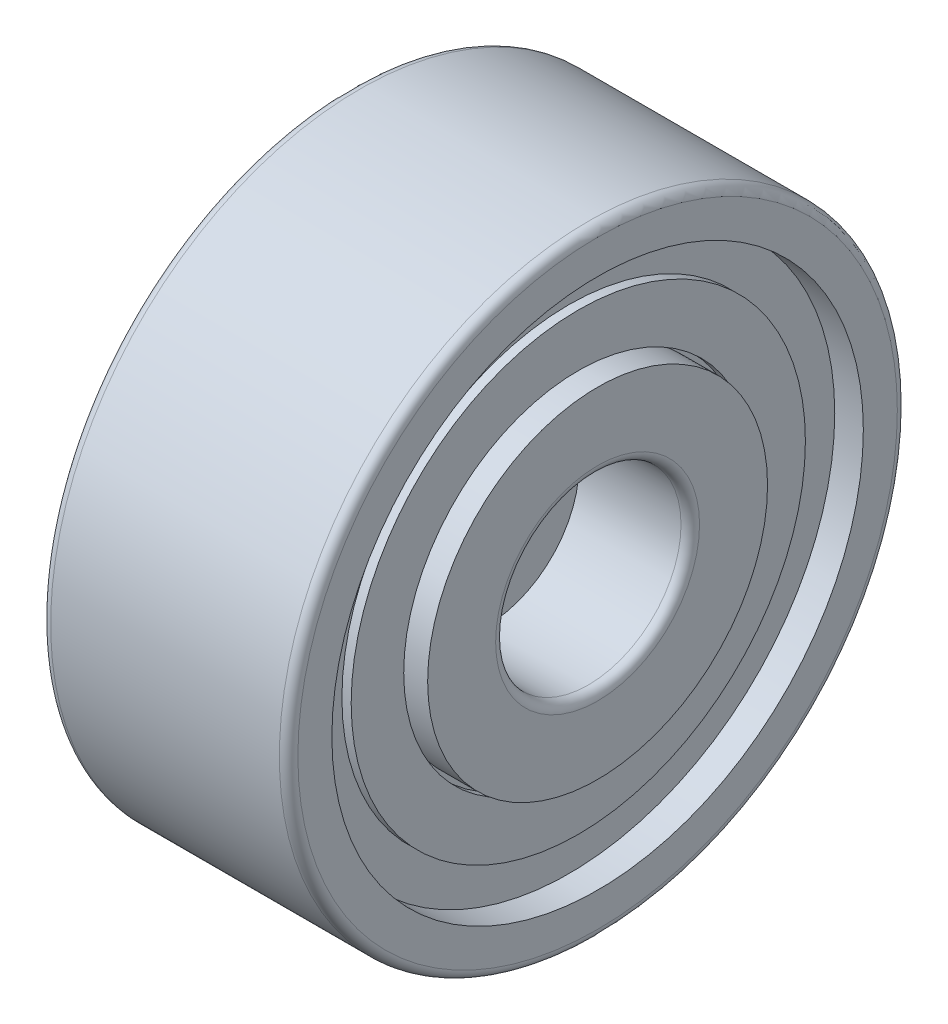
ISO-10303-21;
HEADER;
FILE_DESCRIPTION(('STEP AP214'),'2;1');
FILE_NAME('part.step','',(''),(''),'','','');
FILE_SCHEMA(('AUTOMOTIVE_DESIGN { 1 0 10303 214 1 1 1 1 }'));
ENDSEC;
DATA;
#1=APPLICATION_CONTEXT('core data for automotive mechanical design processes');
#2=APPLICATION_PROTOCOL_DEFINITION('international standard','automotive_design',2000,#1);
#3=PRODUCT_CONTEXT('',#1,'mechanical');
#4=PRODUCT('Part','Part','',(#3));
#5=PRODUCT_RELATED_PRODUCT_CATEGORY('part','',(#4));
#6=PRODUCT_DEFINITION_FORMATION('','',#4);
#7=PRODUCT_DEFINITION_CONTEXT('part definition',#1,'design');
#8=PRODUCT_DEFINITION('design','',#6,#7);
#9=PRODUCT_DEFINITION_SHAPE('','',#8);
#10=(LENGTH_UNIT() NAMED_UNIT(*) SI_UNIT(.MILLI.,.METRE.));
#11=(NAMED_UNIT(*) PLANE_ANGLE_UNIT() SI_UNIT($,.RADIAN.));
#12=(NAMED_UNIT(*) SI_UNIT($,.STERADIAN.) SOLID_ANGLE_UNIT());
#13=UNCERTAINTY_MEASURE_WITH_UNIT(LENGTH_MEASURE(1.E-05),#10,'distance_accuracy_value','');
#14=(GEOMETRIC_REPRESENTATION_CONTEXT(3) GLOBAL_UNCERTAINTY_ASSIGNED_CONTEXT((#13)) GLOBAL_UNIT_ASSIGNED_CONTEXT((#10,
#11,#12)) REPRESENTATION_CONTEXT('',''));
#15=CARTESIAN_POINT('',(0.,0.,0.));
#16=DIRECTION('',(0.,0.,1.));
#17=DIRECTION('',(1.,0.,0.));
#18=AXIS2_PLACEMENT_3D('',#15,#16,#17);
#19=CARTESIAN_POINT('',(1.1,0.,0.75));
#20=DIRECTION('',(1.,0.,0.));
#21=DIRECTION('',(0.,0.,-1.));
#22=AXIS2_PLACEMENT_3D('',#19,#20,#21);
#23=PLANE('',#22);
#24=CARTESIAN_POINT('',(1.1,0.,0.));
#25=DIRECTION('',(1.,0.,0.));
#26=DIRECTION('',(0.,0.,-1.));
#27=AXIS2_PLACEMENT_3D('',#24,#25,#26);
#28=CIRCLE('',#27,1.5);
#29=CARTESIAN_POINT('',(1.1,0.,-1.5));
#30=VERTEX_POINT('',#29);
#31=EDGE_CURVE('P0_E91',#30,#30,#28,.T.);
#32=ORIENTED_EDGE('',*,*,#31,.T.);
#33=EDGE_LOOP('',(#32));
#34=FACE_BOUND('',#33,.T.);
#35=ADVANCED_FACE('P0_F17',(#34),#23,.T.);
#36=CARTESIAN_POINT('',(0.9,0.,0.));
#37=DIRECTION('',(1.,0.,0.));
#38=DIRECTION('',(0.,0.,-1.));
#39=AXIS2_PLACEMENT_3D('',#36,#37,#38);
#40=CYLINDRICAL_SURFACE('',#39,1.5);
#41=ORIENTED_EDGE('',*,*,#31,.F.);
#42=EDGE_LOOP('',(#41));
#43=FACE_BOUND('',#42,.T.);
#44=CARTESIAN_POINT('',(2.75,0.,0.));
#45=DIRECTION('',(1.,0.,0.));
#46=DIRECTION('',(0.,0.,1.));
#47=AXIS2_PLACEMENT_3D('',#44,#45,#46);
#48=CIRCLE('',#47,1.5);
#49=CARTESIAN_POINT('',(2.75,0.,1.5));
#50=VERTEX_POINT('',#49);
#51=EDGE_CURVE('P0_E50',#50,#50,#48,.F.);
#52=ORIENTED_EDGE('',*,*,#51,.F.);
#53=EDGE_LOOP('',(#52));
#54=FACE_BOUND('',#53,.T.);
#55=ADVANCED_FACE('P0_F78',(#43,#54),#40,.F.);
#56=CARTESIAN_POINT('',(2.75,0.,0.));
#57=DIRECTION('',(1.,0.,0.));
#58=DIRECTION('',(0.,0.,1.));
#59=AXIS2_PLACEMENT_3D('',#56,#57,#58);
#60=TOROIDAL_SURFACE('',#59,1.65,0.149999999999999);
#61=CARTESIAN_POINT('',(2.9,0.,0.));
#62=DIRECTION('',(1.,0.,0.));
#63=DIRECTION('',(0.,0.,-1.));
#64=AXIS2_PLACEMENT_3D('',#61,#62,#63);
#65=CIRCLE('',#64,1.65);
#66=CARTESIAN_POINT('',(2.9,0.,1.65));
#67=VERTEX_POINT('',#66);
#68=CARTESIAN_POINT('',(2.9,0.,-1.65));
#69=VERTEX_POINT('',#68);
#70=EDGE_CURVE('P0_E45',#67,#69,#65,.F.);
#71=ORIENTED_EDGE('',*,*,#70,.F.);
#72=CARTESIAN_POINT('',(2.9,0.,0.));
#73=DIRECTION('',(1.,0.,0.));
#74=DIRECTION('',(0.,0.,1.));
#75=AXIS2_PLACEMENT_3D('',#72,#73,#74);
#76=CIRCLE('',#75,1.65);
#77=EDGE_CURVE('P0_E42',#69,#67,#76,.F.);
#78=ORIENTED_EDGE('',*,*,#77,.F.);
#79=EDGE_LOOP('',(#71,#78));
#80=FACE_BOUND('',#79,.T.);
#81=ORIENTED_EDGE('',*,*,#51,.T.);
#82=EDGE_LOOP('',(#81));
#83=FACE_BOUND('',#82,.T.);
#84=ADVANCED_FACE('P0_F46',(#80,#83),#60,.T.);
#85=CARTESIAN_POINT('',(2.9,0.,-2.2));
#86=DIRECTION('',(1.,0.,0.));
#87=DIRECTION('',(0.,0.,-1.));
#88=AXIS2_PLACEMENT_3D('',#85,#86,#87);
#89=PLANE('',#88);
#90=CARTESIAN_POINT('',(2.9,0.,0.));
#91=DIRECTION('',(1.,0.,0.));
#92=DIRECTION('',(0.,0.,-1.));
#93=AXIS2_PLACEMENT_3D('',#90,#91,#92);
#94=CIRCLE('',#93,2.75);
#95=CARTESIAN_POINT('',(2.9,0.,-2.75));
#96=VERTEX_POINT('',#95);
#97=EDGE_CURVE('P0_E54',#96,#96,#94,.F.);
#98=ORIENTED_EDGE('',*,*,#97,.F.);
#99=EDGE_LOOP('',(#98));
#100=FACE_BOUND('',#99,.T.);
#101=ORIENTED_EDGE('',*,*,#70,.T.);
#102=ORIENTED_EDGE('',*,*,#77,.T.);
#103=EDGE_LOOP('',(#101,#102));
#104=FACE_BOUND('',#103,.T.);
#105=ADVANCED_FACE('P0_F53',(#100,#104),#89,.T.);
#106=CARTESIAN_POINT('',(2.59375,0.,0.));
#107=DIRECTION('',(1.,0.,0.));
#108=DIRECTION('',(0.,0.,-1.));
#109=AXIS2_PLACEMENT_3D('',#106,#107,#108);
#110=CYLINDRICAL_SURFACE('',#109,2.75);
#111=ORIENTED_EDGE('',*,*,#97,.T.);
#112=EDGE_LOOP('',(#111));
#113=FACE_BOUND('',#112,.T.);
#114=CARTESIAN_POINT('',(2.2875,0.,0.));
#115=DIRECTION('',(1.,0.,0.));
#116=DIRECTION('',(0.,0.,-1.));
#117=AXIS2_PLACEMENT_3D('',#114,#115,#116);
#118=CIRCLE('',#117,2.75);
#119=CARTESIAN_POINT('',(2.2875,0.,-2.75));
#120=VERTEX_POINT('',#119);
#121=EDGE_CURVE('P0_E110',#120,#120,#118,.F.);
#122=ORIENTED_EDGE('',*,*,#121,.F.);
#123=EDGE_LOOP('',(#122));
#124=FACE_BOUND('',#123,.T.);
#125=ADVANCED_FACE('P0_F72',(#113,#124),#110,.T.);
#126=CARTESIAN_POINT('',(2.2875,0.,-2.825));
#127=DIRECTION('',(1.,0.,0.));
#128=DIRECTION('',(0.,0.,-1.));
#129=AXIS2_PLACEMENT_3D('',#126,#127,#128);
#130=PLANE('',#129);
#131=CARTESIAN_POINT('',(2.2875,0.,0.));
#132=DIRECTION('',(1.,0.,0.));
#133=DIRECTION('',(0.,0.,-1.));
#134=AXIS2_PLACEMENT_3D('',#131,#132,#133);
#135=CIRCLE('',#134,2.9);
#136=CARTESIAN_POINT('',(2.2875,0.,-2.9));
#137=VERTEX_POINT('',#136);
#138=EDGE_CURVE('P0_E106',#137,#137,#135,.F.);
#139=ORIENTED_EDGE('',*,*,#138,.F.);
#140=EDGE_LOOP('',(#139));
#141=FACE_BOUND('',#140,.T.);
#142=ORIENTED_EDGE('',*,*,#121,.T.);
#143=EDGE_LOOP('',(#142));
#144=FACE_BOUND('',#143,.T.);
#145=ADVANCED_FACE('P0_F167',(#141,#144),#130,.T.);
#146=CARTESIAN_POINT('',(1.82287878475,0.,0.));
#147=DIRECTION('',(1.,0.,0.));
#148=DIRECTION('',(0.,0.,-1.));
#149=AXIS2_PLACEMENT_3D('',#146,#147,#148);
#150=CYLINDRICAL_SURFACE('',#149,2.9);
#151=ORIENTED_EDGE('',*,*,#138,.T.);
#152=EDGE_LOOP('',(#151));
#153=FACE_BOUND('',#152,.T.);
#154=CARTESIAN_POINT('',(1.35825756949846,0.,0.));
#155=DIRECTION('',(1.,0.,0.));
#156=DIRECTION('',(0.,0.,1.));
#157=AXIS2_PLACEMENT_3D('',#154,#155,#156);
#158=CIRCLE('',#157,2.9000000000021);
#159=CARTESIAN_POINT('',(1.35825756949846,0.,2.9000000000021));
#160=VERTEX_POINT('',#159);
#161=EDGE_CURVE('P0_E109',#160,#160,#158,.T.);
#162=ORIENTED_EDGE('',*,*,#161,.T.);
#163=EDGE_LOOP('',(#162));
#164=FACE_BOUND('',#163,.T.);
#165=ADVANCED_FACE('P0_F163',(#153,#164),#150,.T.);
#166=CARTESIAN_POINT('',(0.899999999999999,0.,0.));
#167=DIRECTION('',(1.,0.,0.));
#168=DIRECTION('',(0.,0.,1.));
#169=AXIS2_PLACEMENT_3D('',#166,#167,#168);
#170=TOROIDAL_SURFACE('',#169,3.525,0.775000000000002);
#171=ORIENTED_EDGE('',*,*,#161,.F.);
#172=EDGE_LOOP('',(#171));
#173=FACE_BOUND('',#172,.T.);
#174=CARTESIAN_POINT('',(0.441742430504409,0.,0.));
#175=DIRECTION('',(1.,0.,0.));
#176=DIRECTION('',(0.,0.,-1.));
#177=AXIS2_PLACEMENT_3D('',#174,#175,#176);
#178=CIRCLE('',#177,2.9);
#179=CARTESIAN_POINT('',(0.441742430504409,0.,-2.9));
#180=VERTEX_POINT('',#179);
#181=EDGE_CURVE('P0_E105',#180,#180,#178,.F.);
#182=ORIENTED_EDGE('',*,*,#181,.F.);
#183=EDGE_LOOP('',(#182));
#184=FACE_BOUND('',#183,.T.);
#185=ADVANCED_FACE('P0_F158',(#173,#184),#170,.F.);
#186=CARTESIAN_POINT('',(-0.0228787847477956,0.,0.));
#187=DIRECTION('',(1.,0.,0.));
#188=DIRECTION('',(0.,0.,-1.));
#189=AXIS2_PLACEMENT_3D('',#186,#187,#188);
#190=CYLINDRICAL_SURFACE('',#189,2.9);
#191=ORIENTED_EDGE('',*,*,#181,.T.);
#192=EDGE_LOOP('',(#191));
#193=FACE_BOUND('',#192,.T.);
#194=CARTESIAN_POINT('',(-0.4875,0.,0.));
#195=DIRECTION('',(1.,0.,0.));
#196=DIRECTION('',(0.,0.,-1.));
#197=AXIS2_PLACEMENT_3D('',#194,#195,#196);
#198=CIRCLE('',#197,2.9);
#199=CARTESIAN_POINT('',(-0.4875,0.,-2.9));
#200=VERTEX_POINT('',#199);
#201=EDGE_CURVE('P0_E102',#200,#200,#198,.F.);
#202=ORIENTED_EDGE('',*,*,#201,.F.);
#203=EDGE_LOOP('',(#202));
#204=FACE_BOUND('',#203,.T.);
#205=ADVANCED_FACE('P0_F162',(#193,#204),#190,.T.);
#206=CARTESIAN_POINT('',(0.,0.,0.75));
#207=DIRECTION('',(-1.,0.,0.));
#208=DIRECTION('',(0.,0.,1.));
#209=AXIS2_PLACEMENT_3D('',#206,#207,#208);
#210=PLANE('',#209);
#211=CARTESIAN_POINT('',(0.,0.,0.));
#212=DIRECTION('',(1.,0.,0.));
#213=DIRECTION('',(0.,0.,-1.));
#214=AXIS2_PLACEMENT_3D('',#211,#212,#213);
#215=CIRCLE('',#214,1.5);
#216=CARTESIAN_POINT('',(0.,0.,-1.5));
#217=VERTEX_POINT('',#216);
#218=EDGE_CURVE('P0_E99',#217,#217,#215,.F.);
#219=ORIENTED_EDGE('',*,*,#218,.T.);
#220=EDGE_LOOP('',(#219));
#221=FACE_BOUND('',#220,.T.);
#222=ADVANCED_FACE('P0_F198',(#221),#210,.T.);
#223=CARTESIAN_POINT('',(-0.4875,0.,-2.825));
#224=DIRECTION('',(-1.,0.,0.));
#225=DIRECTION('',(0.,0.,1.));
#226=AXIS2_PLACEMENT_3D('',#223,#224,#225);
#227=PLANE('',#226);
#228=CARTESIAN_POINT('',(-0.4875,0.,0.));
#229=DIRECTION('',(1.,0.,0.));
#230=DIRECTION('',(0.,0.,-1.));
#231=AXIS2_PLACEMENT_3D('',#228,#229,#230);
#232=CIRCLE('',#231,2.75);
#233=CARTESIAN_POINT('',(-0.4875,0.,-2.75));
#234=VERTEX_POINT('',#233);
#235=EDGE_CURVE('P0_E96',#234,#234,#232,.F.);
#236=ORIENTED_EDGE('',*,*,#235,.F.);
#237=EDGE_LOOP('',(#236));
#238=FACE_BOUND('',#237,.T.);
#239=ORIENTED_EDGE('',*,*,#201,.T.);
#240=EDGE_LOOP('',(#239));
#241=FACE_BOUND('',#240,.T.);
#242=ADVANCED_FACE('P0_F192',(#238,#241),#227,.T.);
#243=CARTESIAN_POINT('',(0.9,0.,0.));
#244=DIRECTION('',(1.,0.,0.));
#245=DIRECTION('',(0.,0.,-1.));
#246=AXIS2_PLACEMENT_3D('',#243,#244,#245);
#247=CYLINDRICAL_SURFACE('',#246,1.5);
#248=CARTESIAN_POINT('',(-0.95,0.,0.));
#249=DIRECTION('',(1.,0.,0.));
#250=DIRECTION('',(0.,0.,1.));
#251=AXIS2_PLACEMENT_3D('',#248,#249,#250);
#252=CIRCLE('',#251,1.5);
#253=CARTESIAN_POINT('',(-0.95,0.,1.5));
#254=VERTEX_POINT('',#253);
#255=EDGE_CURVE('P0_E95',#254,#254,#252,.T.);
#256=ORIENTED_EDGE('',*,*,#255,.F.);
#257=EDGE_LOOP('',(#256));
#258=FACE_BOUND('',#257,.T.);
#259=ORIENTED_EDGE('',*,*,#218,.F.);
#260=EDGE_LOOP('',(#259));
#261=FACE_BOUND('',#260,.T.);
#262=ADVANCED_FACE('P0_F187',(#258,#261),#247,.F.);
#263=CARTESIAN_POINT('',(-0.79375,0.,0.));
#264=DIRECTION('',(1.,0.,0.));
#265=DIRECTION('',(0.,0.,-1.));
#266=AXIS2_PLACEMENT_3D('',#263,#264,#265);
#267=CYLINDRICAL_SURFACE('',#266,2.75);
#268=ORIENTED_EDGE('',*,*,#235,.T.);
#269=EDGE_LOOP('',(#268));
#270=FACE_BOUND('',#269,.T.);
#271=CARTESIAN_POINT('',(-1.1,0.,0.));
#272=DIRECTION('',(1.,0.,0.));
#273=DIRECTION('',(0.,0.,-1.));
#274=AXIS2_PLACEMENT_3D('',#271,#272,#273);
#275=CIRCLE('',#274,2.75);
#276=CARTESIAN_POINT('',(-1.1,0.,-2.75));
#277=VERTEX_POINT('',#276);
#278=EDGE_CURVE('P0_E92',#277,#277,#275,.F.);
#279=ORIENTED_EDGE('',*,*,#278,.F.);
#280=EDGE_LOOP('',(#279));
#281=FACE_BOUND('',#280,.T.);
#282=ADVANCED_FACE('P0_F132',(#270,#281),#267,.T.);
#283=CARTESIAN_POINT('',(-0.95,0.,0.));
#284=DIRECTION('',(1.,0.,0.));
#285=DIRECTION('',(0.,0.,1.));
#286=AXIS2_PLACEMENT_3D('',#283,#284,#285);
#287=TOROIDAL_SURFACE('',#286,1.65,0.15);
#288=ORIENTED_EDGE('',*,*,#255,.T.);
#289=EDGE_LOOP('',(#288));
#290=FACE_BOUND('',#289,.T.);
#291=CARTESIAN_POINT('',(-1.1,0.,0.));
#292=DIRECTION('',(-1.,0.,0.));
#293=DIRECTION('',(0.,0.,-1.));
#294=AXIS2_PLACEMENT_3D('',#291,#292,#293);
#295=CIRCLE('',#294,1.65);
#296=CARTESIAN_POINT('',(-1.1,0.,1.65));
#297=VERTEX_POINT('',#296);
#298=CARTESIAN_POINT('',(-1.1,0.,-1.65));
#299=VERTEX_POINT('',#298);
#300=EDGE_CURVE('P0_E11',#297,#299,#295,.F.);
#301=ORIENTED_EDGE('',*,*,#300,.F.);
#302=CARTESIAN_POINT('',(-1.1,0.,0.));
#303=DIRECTION('',(-1.,0.,0.));
#304=DIRECTION('',(0.,0.,1.));
#305=AXIS2_PLACEMENT_3D('',#302,#303,#304);
#306=CIRCLE('',#305,1.65);
#307=EDGE_CURVE('P0_E28',#299,#297,#306,.F.);
#308=ORIENTED_EDGE('',*,*,#307,.F.);
#309=EDGE_LOOP('',(#301,#308));
#310=FACE_BOUND('',#309,.T.);
#311=ADVANCED_FACE('P0_F120',(#290,#310),#287,.T.);
#312=CARTESIAN_POINT('',(-1.1,0.,-2.2));
#313=DIRECTION('',(-1.,0.,0.));
#314=DIRECTION('',(0.,0.,1.));
#315=AXIS2_PLACEMENT_3D('',#312,#313,#314);
#316=PLANE('',#315);
#317=ORIENTED_EDGE('',*,*,#307,.T.);
#318=ORIENTED_EDGE('',*,*,#300,.T.);
#319=EDGE_LOOP('',(#317,#318));
#320=FACE_BOUND('',#319,.T.);
#321=ORIENTED_EDGE('',*,*,#278,.T.);
#322=EDGE_LOOP('',(#321));
#323=FACE_BOUND('',#322,.T.);
#324=ADVANCED_FACE('P0_F131',(#320,#323),#316,.T.);
#325=CLOSED_SHELL('',(#35,#55,#84,#105,#125,#145,#165,#185,#205,#222,#242,#262,#282,#311,#324));
#326=MANIFOLD_SOLID_BREP('P0_B1',#325);
#327=CARTESIAN_POINT('',(0.9,0.,0.));
#328=DIRECTION('',(1.,0.,0.));
#329=DIRECTION('',(0.,0.,1.));
#330=AXIS2_PLACEMENT_3D('',#327,#328,#329);
#331=TOROIDAL_SURFACE('',#330,3.525,0.774999999999997);
#332=CARTESIAN_POINT('',(0.4417424305,0.,0.));
#333=DIRECTION('',(1.,0.,0.));
#334=DIRECTION('',(0.,0.,-1.));
#335=AXIS2_PLACEMENT_3D('',#332,#333,#334);
#336=CIRCLE('',#335,4.15);
#337=CARTESIAN_POINT('',(0.4417424305,0.,-4.15));
#338=VERTEX_POINT('',#337);
#339=EDGE_CURVE('P1_E466',#338,#338,#336,.F.);
#340=ORIENTED_EDGE('',*,*,#339,.T.);
#341=EDGE_LOOP('',(#340));
#342=FACE_BOUND('',#341,.T.);
#343=CARTESIAN_POINT('',(1.35825756949559,0.,0.));
#344=DIRECTION('',(1.,0.,0.));
#345=DIRECTION('',(0.,0.,-1.));
#346=AXIS2_PLACEMENT_3D('',#343,#344,#345);
#347=CIRCLE('',#346,4.15);
#348=CARTESIAN_POINT('',(1.35825756949559,0.,-4.15));
#349=VERTEX_POINT('',#348);
#350=EDGE_CURVE('P1_E463',#349,#349,#347,.T.);
#351=ORIENTED_EDGE('',*,*,#350,.T.);
#352=EDGE_LOOP('',(#351));
#353=FACE_BOUND('',#352,.T.);
#354=ADVANCED_FACE('P1_F17',(#342,#353),#331,.F.);
#355=CARTESIAN_POINT('',(-0.02287878475,0.,0.));
#356=DIRECTION('',(1.,0.,0.));
#357=DIRECTION('',(0.,0.,-1.));
#358=AXIS2_PLACEMENT_3D('',#355,#356,#357);
#359=CYLINDRICAL_SURFACE('',#358,4.15);
#360=CARTESIAN_POINT('',(-0.4875,0.,0.));
#361=DIRECTION('',(1.,0.,0.));
#362=DIRECTION('',(0.,0.,-1.));
#363=AXIS2_PLACEMENT_3D('',#360,#361,#362);
#364=CIRCLE('',#363,4.15);
#365=CARTESIAN_POINT('',(-0.4875,0.,-4.15));
#366=VERTEX_POINT('',#365);
#367=EDGE_CURVE('P1_E461',#366,#366,#364,.T.);
#368=ORIENTED_EDGE('',*,*,#367,.F.);
#369=EDGE_LOOP('',(#368));
#370=FACE_BOUND('',#369,.T.);
#371=ORIENTED_EDGE('',*,*,#339,.F.);
#372=EDGE_LOOP('',(#371));
#373=FACE_BOUND('',#372,.T.);
#374=ADVANCED_FACE('P1_F217',(#370,#373),#359,.F.);
#375=CARTESIAN_POINT('',(1.8228787847478,0.,0.));
#376=DIRECTION('',(1.,0.,0.));
#377=DIRECTION('',(0.,0.,-1.));
#378=AXIS2_PLACEMENT_3D('',#375,#376,#377);
#379=CYLINDRICAL_SURFACE('',#378,4.15);
#380=ORIENTED_EDGE('',*,*,#350,.F.);
#381=EDGE_LOOP('',(#380));
#382=FACE_BOUND('',#381,.T.);
#383=CARTESIAN_POINT('',(2.2875,0.,0.));
#384=DIRECTION('',(1.,0.,0.));
#385=DIRECTION('',(0.,0.,-1.));
#386=AXIS2_PLACEMENT_3D('',#383,#384,#385);
#387=CIRCLE('',#386,4.15);
#388=CARTESIAN_POINT('',(2.2875,0.,-4.15));
#389=VERTEX_POINT('',#388);
#390=EDGE_CURVE('P1_E459',#389,#389,#387,.F.);
#391=ORIENTED_EDGE('',*,*,#390,.F.);
#392=EDGE_LOOP('',(#391));
#393=FACE_BOUND('',#392,.T.);
#394=ADVANCED_FACE('P1_F210',(#382,#393),#379,.F.);
#395=CARTESIAN_POINT('',(-0.4875,0.,3.9125));
#396=DIRECTION('',(1.,0.,0.));
#397=DIRECTION('',(0.,0.,-1.));
#398=AXIS2_PLACEMENT_3D('',#395,#396,#397);
#399=PLANE('',#398);
#400=ORIENTED_EDGE('',*,*,#367,.T.);
#401=EDGE_LOOP('',(#400));
#402=FACE_BOUND('',#401,.T.);
#403=CARTESIAN_POINT('',(-0.4875,0.,0.));
#404=DIRECTION('',(1.,0.,0.));
#405=DIRECTION('',(0.,0.,-1.));
#406=AXIS2_PLACEMENT_3D('',#403,#404,#405);
#407=CIRCLE('',#406,3.525);
#408=CARTESIAN_POINT('',(-0.4875,0.,-3.525));
#409=VERTEX_POINT('',#408);
#410=EDGE_CURVE('P1_E456',#409,#409,#407,.F.);
#411=ORIENTED_EDGE('',*,*,#410,.T.);
#412=EDGE_LOOP('',(#411));
#413=FACE_BOUND('',#412,.T.);
#414=ADVANCED_FACE('P1_F216',(#402,#413),#399,.T.);
#415=CARTESIAN_POINT('',(2.2875,0.,3.9125));
#416=DIRECTION('',(-1.,0.,0.));
#417=DIRECTION('',(0.,0.,1.));
#418=AXIS2_PLACEMENT_3D('',#415,#416,#417);
#419=PLANE('',#418);
#420=ORIENTED_EDGE('',*,*,#390,.T.);
#421=EDGE_LOOP('',(#420));
#422=FACE_BOUND('',#421,.T.);
#423=CARTESIAN_POINT('',(2.2875,0.,0.));
#424=DIRECTION('',(-1.,0.,0.));
#425=DIRECTION('',(0.,0.,1.));
#426=AXIS2_PLACEMENT_3D('',#423,#424,#425);
#427=CIRCLE('',#426,3.525);
#428=CARTESIAN_POINT('',(2.2875,0.,3.525));
#429=VERTEX_POINT('',#428);
#430=EDGE_CURVE('P1_E453',#429,#429,#427,.F.);
#431=ORIENTED_EDGE('',*,*,#430,.T.);
#432=EDGE_LOOP('',(#431));
#433=FACE_BOUND('',#432,.T.);
#434=ADVANCED_FACE('P1_F273',(#422,#433),#419,.T.);
#435=CARTESIAN_POINT('',(-0.5625,0.,0.));
#436=DIRECTION('',(1.,0.,0.));
#437=DIRECTION('',(0.,0.,-1.));
#438=AXIS2_PLACEMENT_3D('',#435,#436,#437);
#439=CYLINDRICAL_SURFACE('',#438,3.525);
#440=CARTESIAN_POINT('',(-0.6375,0.,0.));
#441=DIRECTION('',(1.,0.,0.));
#442=DIRECTION('',(0.,0.,-1.));
#443=AXIS2_PLACEMENT_3D('',#440,#441,#442);
#444=CIRCLE('',#443,3.525);
#445=CARTESIAN_POINT('',(-0.6375,0.,-3.525));
#446=VERTEX_POINT('',#445);
#447=EDGE_CURVE('P1_E450',#446,#446,#444,.T.);
#448=ORIENTED_EDGE('',*,*,#447,.F.);
#449=EDGE_LOOP('',(#448));
#450=FACE_BOUND('',#449,.T.);
#451=ORIENTED_EDGE('',*,*,#410,.F.);
#452=EDGE_LOOP('',(#451));
#453=FACE_BOUND('',#452,.T.);
#454=ADVANCED_FACE('P1_F280',(#450,#453),#439,.F.);
#455=CARTESIAN_POINT('',(2.3625,0.,0.));
#456=DIRECTION('',(-1.,0.,0.));
#457=DIRECTION('',(0.,0.,1.));
#458=AXIS2_PLACEMENT_3D('',#455,#456,#457);
#459=CYLINDRICAL_SURFACE('',#458,3.525);
#460=CARTESIAN_POINT('',(2.4375,0.,0.));
#461=DIRECTION('',(-1.,0.,0.));
#462=DIRECTION('',(0.,0.,1.));
#463=AXIS2_PLACEMENT_3D('',#460,#461,#462);
#464=CIRCLE('',#463,3.525);
#465=CARTESIAN_POINT('',(2.4375,0.,3.525));
#466=VERTEX_POINT('',#465);
#467=EDGE_CURVE('P1_E447',#466,#466,#464,.T.);
#468=ORIENTED_EDGE('',*,*,#467,.F.);
#469=EDGE_LOOP('',(#468));
#470=FACE_BOUND('',#469,.T.);
#471=ORIENTED_EDGE('',*,*,#430,.F.);
#472=EDGE_LOOP('',(#471));
#473=FACE_BOUND('',#472,.T.);
#474=ADVANCED_FACE('P1_F288',(#470,#473),#459,.F.);
#475=CARTESIAN_POINT('',(-0.6375,0.,3.175));
#476=DIRECTION('',(1.,0.,0.));
#477=DIRECTION('',(0.,0.,-1.));
#478=AXIS2_PLACEMENT_3D('',#475,#476,#477);
#479=PLANE('',#478);
#480=ORIENTED_EDGE('',*,*,#447,.T.);
#481=EDGE_LOOP('',(#480));
#482=FACE_BOUND('',#481,.T.);
#483=CARTESIAN_POINT('',(-0.6375,0.,0.));
#484=DIRECTION('',(1.,0.,0.));
#485=DIRECTION('',(0.,0.,-1.));
#486=AXIS2_PLACEMENT_3D('',#483,#484,#485);
#487=CIRCLE('',#486,2.825);
#488=CARTESIAN_POINT('',(-0.6375,0.,-2.825));
#489=VERTEX_POINT('',#488);
#490=EDGE_CURVE('P1_E444',#489,#489,#487,.F.);
#491=ORIENTED_EDGE('',*,*,#490,.T.);
#492=EDGE_LOOP('',(#491));
#493=FACE_BOUND('',#492,.T.);
#494=ADVANCED_FACE('P1_F296',(#482,#493),#479,.T.);
#495=CARTESIAN_POINT('',(2.4375,0.,3.175));
#496=DIRECTION('',(-1.,0.,0.));
#497=DIRECTION('',(0.,0.,1.));
#498=AXIS2_PLACEMENT_3D('',#495,#496,#497);
#499=PLANE('',#498);
#500=ORIENTED_EDGE('',*,*,#467,.T.);
#501=EDGE_LOOP('',(#500));
#502=FACE_BOUND('',#501,.T.);
#503=CARTESIAN_POINT('',(2.4375,0.,0.));
#504=DIRECTION('',(-1.,0.,0.));
#505=DIRECTION('',(0.,0.,1.));
#506=AXIS2_PLACEMENT_3D('',#503,#504,#505);
#507=CIRCLE('',#506,2.825);
#508=CARTESIAN_POINT('',(2.4375,0.,2.825));
#509=VERTEX_POINT('',#508);
#510=EDGE_CURVE('P1_E441',#509,#509,#507,.F.);
#511=ORIENTED_EDGE('',*,*,#510,.T.);
#512=EDGE_LOOP('',(#511));
#513=FACE_BOUND('',#512,.T.);
#514=ADVANCED_FACE('P1_F304',(#502,#513),#499,.T.);
#515=CARTESIAN_POINT('',(-0.7125,0.,0.));
#516=DIRECTION('',(1.,0.,0.));
#517=DIRECTION('',(0.,0.,-1.));
#518=AXIS2_PLACEMENT_3D('',#515,#516,#517);
#519=CYLINDRICAL_SURFACE('',#518,2.825);
#520=CARTESIAN_POINT('',(-0.7875,0.,0.));
#521=DIRECTION('',(1.,0.,0.));
#522=DIRECTION('',(0.,0.,-1.));
#523=AXIS2_PLACEMENT_3D('',#520,#521,#522);
#524=CIRCLE('',#523,2.825);
#525=CARTESIAN_POINT('',(-0.7875,0.,-2.825));
#526=VERTEX_POINT('',#525);
#527=EDGE_CURVE('P1_E438',#526,#526,#524,.T.);
#528=ORIENTED_EDGE('',*,*,#527,.F.);
#529=EDGE_LOOP('',(#528));
#530=FACE_BOUND('',#529,.T.);
#531=ORIENTED_EDGE('',*,*,#490,.F.);
#532=EDGE_LOOP('',(#531));
#533=FACE_BOUND('',#532,.T.);
#534=ADVANCED_FACE('P1_F312',(#530,#533),#519,.F.);
#535=CARTESIAN_POINT('',(2.5125,0.,0.));
#536=DIRECTION('',(-1.,0.,0.));
#537=DIRECTION('',(0.,0.,1.));
#538=AXIS2_PLACEMENT_3D('',#535,#536,#537);
#539=CYLINDRICAL_SURFACE('',#538,2.825);
#540=CARTESIAN_POINT('',(2.5875,0.,0.));
#541=DIRECTION('',(-1.,0.,0.));
#542=DIRECTION('',(0.,0.,1.));
#543=AXIS2_PLACEMENT_3D('',#540,#541,#542);
#544=CIRCLE('',#543,2.825);
#545=CARTESIAN_POINT('',(2.5875,0.,2.825));
#546=VERTEX_POINT('',#545);
#547=EDGE_CURVE('P1_E435',#546,#546,#544,.T.);
#548=ORIENTED_EDGE('',*,*,#547,.F.);
#549=EDGE_LOOP('',(#548));
#550=FACE_BOUND('',#549,.T.);
#551=ORIENTED_EDGE('',*,*,#510,.F.);
#552=EDGE_LOOP('',(#551));
#553=FACE_BOUND('',#552,.T.);
#554=ADVANCED_FACE('P1_F320',(#550,#553),#539,.F.);
#555=CARTESIAN_POINT('',(-0.7875,0.,3.25));
#556=DIRECTION('',(-1.,0.,0.));
#557=DIRECTION('',(0.,0.,1.));
#558=AXIS2_PLACEMENT_3D('',#555,#556,#557);
#559=PLANE('',#558);
#560=ORIENTED_EDGE('',*,*,#527,.T.);
#561=EDGE_LOOP('',(#560));
#562=FACE_BOUND('',#561,.T.);
#563=CARTESIAN_POINT('',(-0.7875,0.,0.));
#564=DIRECTION('',(1.,0.,0.));
#565=DIRECTION('',(0.,0.,-1.));
#566=AXIS2_PLACEMENT_3D('',#563,#564,#565);
#567=CIRCLE('',#566,3.675);
#568=CARTESIAN_POINT('',(-0.7875,0.,-3.675));
#569=VERTEX_POINT('',#568);
#570=EDGE_CURVE('P1_E432',#569,#569,#567,.T.);
#571=ORIENTED_EDGE('',*,*,#570,.F.);
#572=EDGE_LOOP('',(#571));
#573=FACE_BOUND('',#572,.T.);
#574=ADVANCED_FACE('P1_F328',(#562,#573),#559,.T.);
#575=CARTESIAN_POINT('',(2.5875,0.,3.25));
#576=DIRECTION('',(1.,0.,0.));
#577=DIRECTION('',(0.,0.,-1.));
#578=AXIS2_PLACEMENT_3D('',#575,#576,#577);
#579=PLANE('',#578);
#580=ORIENTED_EDGE('',*,*,#547,.T.);
#581=EDGE_LOOP('',(#580));
#582=FACE_BOUND('',#581,.T.);
#583=CARTESIAN_POINT('',(2.5875,0.,0.));
#584=DIRECTION('',(-1.,0.,0.));
#585=DIRECTION('',(0.,0.,1.));
#586=AXIS2_PLACEMENT_3D('',#583,#584,#585);
#587=CIRCLE('',#586,3.675);
#588=CARTESIAN_POINT('',(2.5875,0.,3.675));
#589=VERTEX_POINT('',#588);
#590=EDGE_CURVE('P1_E429',#589,#589,#587,.T.);
#591=ORIENTED_EDGE('',*,*,#590,.F.);
#592=EDGE_LOOP('',(#591));
#593=FACE_BOUND('',#592,.T.);
#594=ADVANCED_FACE('P1_F336',(#582,#593),#579,.T.);
#595=CARTESIAN_POINT('',(-0.7125,0.,0.));
#596=DIRECTION('',(1.,0.,0.));
#597=DIRECTION('',(0.,0.,-1.));
#598=AXIS2_PLACEMENT_3D('',#595,#596,#597);
#599=CYLINDRICAL_SURFACE('',#598,3.675);
#600=CARTESIAN_POINT('',(-0.6375,0.,0.));
#601=DIRECTION('',(1.,0.,0.));
#602=DIRECTION('',(0.,0.,-1.));
#603=AXIS2_PLACEMENT_3D('',#600,#601,#602);
#604=CIRCLE('',#603,3.675);
#605=CARTESIAN_POINT('',(-0.6375,0.,-3.675));
#606=VERTEX_POINT('',#605);
#607=EDGE_CURVE('P1_E426',#606,#606,#604,.T.);
#608=ORIENTED_EDGE('',*,*,#607,.F.);
#609=EDGE_LOOP('',(#608));
#610=FACE_BOUND('',#609,.T.);
#611=ORIENTED_EDGE('',*,*,#570,.T.);
#612=EDGE_LOOP('',(#611));
#613=FACE_BOUND('',#612,.T.);
#614=ADVANCED_FACE('P1_F344',(#610,#613),#599,.T.);
#615=CARTESIAN_POINT('',(2.5125,0.,0.));
#616=DIRECTION('',(-1.,0.,0.));
#617=DIRECTION('',(0.,0.,1.));
#618=AXIS2_PLACEMENT_3D('',#615,#616,#617);
#619=CYLINDRICAL_SURFACE('',#618,3.675);
#620=CARTESIAN_POINT('',(2.4375,0.,0.));
#621=DIRECTION('',(-1.,0.,0.));
#622=DIRECTION('',(0.,0.,1.));
#623=AXIS2_PLACEMENT_3D('',#620,#621,#622);
#624=CIRCLE('',#623,3.675);
#625=CARTESIAN_POINT('',(2.4375,0.,3.675));
#626=VERTEX_POINT('',#625);
#627=EDGE_CURVE('P1_E413',#626,#626,#624,.T.);
#628=ORIENTED_EDGE('',*,*,#627,.F.);
#629=EDGE_LOOP('',(#628));
#630=FACE_BOUND('',#629,.T.);
#631=ORIENTED_EDGE('',*,*,#590,.T.);
#632=EDGE_LOOP('',(#631));
#633=FACE_BOUND('',#632,.T.);
#634=ADVANCED_FACE('P1_F352',(#630,#633),#619,.T.);
#635=CARTESIAN_POINT('',(-0.6375,0.,3.9875));
#636=DIRECTION('',(-1.,0.,0.));
#637=DIRECTION('',(0.,0.,1.));
#638=AXIS2_PLACEMENT_3D('',#635,#636,#637);
#639=PLANE('',#638);
#640=ORIENTED_EDGE('',*,*,#607,.T.);
#641=EDGE_LOOP('',(#640));
#642=FACE_BOUND('',#641,.T.);
#643=CARTESIAN_POINT('',(-0.6375,0.,0.));
#644=DIRECTION('',(1.,0.,0.));
#645=DIRECTION('',(0.,0.,-1.));
#646=AXIS2_PLACEMENT_3D('',#643,#644,#645);
#647=CIRCLE('',#646,4.3);
#648=CARTESIAN_POINT('',(-0.6375,0.,-4.3));
#649=VERTEX_POINT('',#648);
#650=EDGE_CURVE('P1_E417',#649,#649,#647,.F.);
#651=ORIENTED_EDGE('',*,*,#650,.T.);
#652=EDGE_LOOP('',(#651));
#653=FACE_BOUND('',#652,.T.);
#654=ADVANCED_FACE('P1_F360',(#642,#653),#639,.T.);
#655=CARTESIAN_POINT('',(2.4375,0.,3.9875));
#656=DIRECTION('',(1.,0.,0.));
#657=DIRECTION('',(0.,0.,-1.));
#658=AXIS2_PLACEMENT_3D('',#655,#656,#657);
#659=PLANE('',#658);
#660=ORIENTED_EDGE('',*,*,#627,.T.);
#661=EDGE_LOOP('',(#660));
#662=FACE_BOUND('',#661,.T.);
#663=CARTESIAN_POINT('',(2.4375,0.,0.));
#664=DIRECTION('',(1.,0.,0.));
#665=DIRECTION('',(0.,0.,-1.));
#666=AXIS2_PLACEMENT_3D('',#663,#664,#665);
#667=CIRCLE('',#666,4.3);
#668=CARTESIAN_POINT('',(2.4375,0.,-4.3));
#669=VERTEX_POINT('',#668);
#670=EDGE_CURVE('P1_E416',#669,#669,#667,.T.);
#671=ORIENTED_EDGE('',*,*,#670,.T.);
#672=EDGE_LOOP('',(#671));
#673=FACE_BOUND('',#672,.T.);
#674=ADVANCED_FACE('P1_F203',(#662,#673),#659,.T.);
#675=CARTESIAN_POINT('',(-0.79375,0.,0.));
#676=DIRECTION('',(1.,0.,0.));
#677=DIRECTION('',(0.,0.,-1.));
#678=AXIS2_PLACEMENT_3D('',#675,#676,#677);
#679=CYLINDRICAL_SURFACE('',#678,4.3);
#680=CARTESIAN_POINT('',(-1.1,0.,0.));
#681=DIRECTION('',(1.,0.,0.));
#682=DIRECTION('',(0.,0.,-1.));
#683=AXIS2_PLACEMENT_3D('',#680,#681,#682);
#684=CIRCLE('',#683,4.3);
#685=CARTESIAN_POINT('',(-1.1,0.,-4.3));
#686=VERTEX_POINT('',#685);
#687=EDGE_CURVE('P1_E55',#686,#686,#684,.T.);
#688=ORIENTED_EDGE('',*,*,#687,.F.);
#689=EDGE_LOOP('',(#688));
#690=FACE_BOUND('',#689,.T.);
#691=ORIENTED_EDGE('',*,*,#650,.F.);
#692=EDGE_LOOP('',(#691));
#693=FACE_BOUND('',#692,.T.);
#694=ADVANCED_FACE('P1_F193',(#690,#693),#679,.F.);
#695=CARTESIAN_POINT('',(2.59375,0.,0.));
#696=DIRECTION('',(1.,0.,0.));
#697=DIRECTION('',(0.,0.,-1.));
#698=AXIS2_PLACEMENT_3D('',#695,#696,#697);
#699=CYLINDRICAL_SURFACE('',#698,4.3);
#700=ORIENTED_EDGE('',*,*,#670,.F.);
#701=EDGE_LOOP('',(#700));
#702=FACE_BOUND('',#701,.T.);
#703=CARTESIAN_POINT('',(2.9,0.,0.));
#704=DIRECTION('',(1.,0.,0.));
#705=DIRECTION('',(0.,0.,-1.));
#706=AXIS2_PLACEMENT_3D('',#703,#704,#705);
#707=CIRCLE('',#706,4.3);
#708=CARTESIAN_POINT('',(2.9,0.,-4.3));
#709=VERTEX_POINT('',#708);
#710=EDGE_CURVE('P1_E54',#709,#709,#707,.F.);
#711=ORIENTED_EDGE('',*,*,#710,.F.);
#712=EDGE_LOOP('',(#711));
#713=FACE_BOUND('',#712,.T.);
#714=ADVANCED_FACE('P1_F80',(#702,#713),#699,.F.);
#715=CARTESIAN_POINT('',(-1.1,0.,-4.575));
#716=DIRECTION('',(-1.,0.,0.));
#717=DIRECTION('',(0.,0.,1.));
#718=AXIS2_PLACEMENT_3D('',#715,#716,#717);
#719=PLANE('',#718);
#720=ORIENTED_EDGE('',*,*,#687,.T.);
#721=EDGE_LOOP('',(#720));
#722=FACE_BOUND('',#721,.T.);
#723=CARTESIAN_POINT('',(-1.1,0.,0.));
#724=DIRECTION('',(1.,0.,0.));
#725=DIRECTION('',(0.,0.,-1.));
#726=AXIS2_PLACEMENT_3D('',#723,#724,#725);
#727=CIRCLE('',#726,4.85);
#728=CARTESIAN_POINT('',(-1.1,0.,-4.85));
#729=VERTEX_POINT('',#728);
#730=CARTESIAN_POINT('',(-1.1,0.,4.85));
#731=VERTEX_POINT('',#730);
#732=EDGE_CURVE('P1_E50',#729,#731,#727,.T.);
#733=ORIENTED_EDGE('',*,*,#732,.F.);
#734=CARTESIAN_POINT('',(-1.1,0.,0.));
#735=DIRECTION('',(1.,0.,0.));
#736=DIRECTION('',(0.,0.,1.));
#737=AXIS2_PLACEMENT_3D('',#734,#735,#736);
#738=CIRCLE('',#737,4.85);
#739=EDGE_CURVE('P1_E46',#731,#729,#738,.T.);
#740=ORIENTED_EDGE('',*,*,#739,.F.);
#741=EDGE_LOOP('',(#733,#740));
#742=FACE_BOUND('',#741,.T.);
#743=ADVANCED_FACE('P1_F59',(#722,#742),#719,.T.);
#744=CARTESIAN_POINT('',(2.9,0.,-4.575));
#745=DIRECTION('',(1.,0.,0.));
#746=DIRECTION('',(0.,0.,-1.));
#747=AXIS2_PLACEMENT_3D('',#744,#745,#746);
#748=PLANE('',#747);
#749=CARTESIAN_POINT('',(2.9,0.,0.));
#750=DIRECTION('',(-1.,0.,0.));
#751=DIRECTION('',(0.,0.,1.));
#752=AXIS2_PLACEMENT_3D('',#749,#750,#751);
#753=CIRCLE('',#752,4.85);
#754=CARTESIAN_POINT('',(2.9,0.,4.85));
#755=VERTEX_POINT('',#754);
#756=CARTESIAN_POINT('',(2.9,0.,-4.85));
#757=VERTEX_POINT('',#756);
#758=EDGE_CURVE('P1_E60',#755,#757,#753,.T.);
#759=ORIENTED_EDGE('',*,*,#758,.F.);
#760=CARTESIAN_POINT('',(2.9,0.,0.));
#761=DIRECTION('',(-1.,0.,0.));
#762=DIRECTION('',(0.,0.,-1.));
#763=AXIS2_PLACEMENT_3D('',#760,#761,#762);
#764=CIRCLE('',#763,4.85);
#765=EDGE_CURVE('P1_E35',#755,#757,#764,.F.);
#766=ORIENTED_EDGE('',*,*,#765,.T.);
#767=EDGE_LOOP('',(#759,#766));
#768=FACE_BOUND('',#767,.T.);
#769=ORIENTED_EDGE('',*,*,#710,.T.);
#770=EDGE_LOOP('',(#769));
#771=FACE_BOUND('',#770,.T.);
#772=ADVANCED_FACE('P1_F79',(#768,#771),#748,.T.);
#773=CARTESIAN_POINT('',(-0.949999999999999,0.,0.));
#774=DIRECTION('',(1.,0.,0.));
#775=DIRECTION('',(0.,0.,1.));
#776=AXIS2_PLACEMENT_3D('',#773,#774,#775);
#777=TOROIDAL_SURFACE('',#776,4.85,0.15);
#778=CARTESIAN_POINT('',(-0.95,0.,0.));
#779=DIRECTION('',(1.,0.,0.));
#780=DIRECTION('',(0.,0.,-1.));
#781=AXIS2_PLACEMENT_3D('',#778,#779,#780);
#782=CIRCLE('',#781,5.);
#783=CARTESIAN_POINT('',(-0.95,0.,-5.));
#784=VERTEX_POINT('',#783);
#785=EDGE_CURVE('P1_E29',#784,#784,#782,.T.);
#786=ORIENTED_EDGE('',*,*,#785,.F.);
#787=EDGE_LOOP('',(#786));
#788=FACE_BOUND('',#787,.T.);
#789=ORIENTED_EDGE('',*,*,#732,.T.);
#790=ORIENTED_EDGE('',*,*,#739,.T.);
#791=EDGE_LOOP('',(#789,#790));
#792=FACE_BOUND('',#791,.T.);
#793=ADVANCED_FACE('P1_F49',(#788,#792),#777,.T.);
#794=CARTESIAN_POINT('',(2.75,0.,0.));
#795=DIRECTION('',(1.,0.,0.));
#796=DIRECTION('',(0.,0.,1.));
#797=AXIS2_PLACEMENT_3D('',#794,#795,#796);
#798=TOROIDAL_SURFACE('',#797,4.85,0.150000000000001);
#799=CARTESIAN_POINT('',(2.75,0.,0.));
#800=DIRECTION('',(1.,0.,0.));
#801=DIRECTION('',(0.,0.,-1.));
#802=AXIS2_PLACEMENT_3D('',#799,#800,#801);
#803=CIRCLE('',#802,5.);
#804=CARTESIAN_POINT('',(2.75,0.,-5.));
#805=VERTEX_POINT('',#804);
#806=EDGE_CURVE('P1_E11',#805,#805,#803,.F.);
#807=ORIENTED_EDGE('',*,*,#806,.F.);
#808=EDGE_LOOP('',(#807));
#809=FACE_BOUND('',#808,.T.);
#810=ORIENTED_EDGE('',*,*,#758,.T.);
#811=ORIENTED_EDGE('',*,*,#765,.F.);
#812=EDGE_LOOP('',(#810,#811));
#813=FACE_BOUND('',#812,.T.);
#814=ADVANCED_FACE('P1_F105',(#809,#813),#798,.T.);
#815=CARTESIAN_POINT('',(0.9,0.,0.));
#816=DIRECTION('',(1.,0.,0.));
#817=DIRECTION('',(0.,0.,-1.));
#818=AXIS2_PLACEMENT_3D('',#815,#816,#817);
#819=CYLINDRICAL_SURFACE('',#818,5.);
#820=ORIENTED_EDGE('',*,*,#785,.T.);
#821=EDGE_LOOP('',(#820));
#822=FACE_BOUND('',#821,.T.);
#823=ORIENTED_EDGE('',*,*,#806,.T.);
#824=EDGE_LOOP('',(#823));
#825=FACE_BOUND('',#824,.T.);
#826=ADVANCED_FACE('P1_F134',(#822,#825),#819,.T.);
#827=CLOSED_SHELL('',(#354,#374,#394,#414,#434,#454,#474,#494,#514,#534,#554,#574,#594,#614,
#634,#654,#674,#694,#714,#743,#772,#793,#814,#826));
#828=MANIFOLD_SOLID_BREP('P1_B1',#827);
#829=ADVANCED_BREP_SHAPE_REPRESENTATION('',(#18,#326,#828),#14);
#830=SHAPE_DEFINITION_REPRESENTATION(#9,#829);
ENDSEC;
END-ISO-10303-21;
